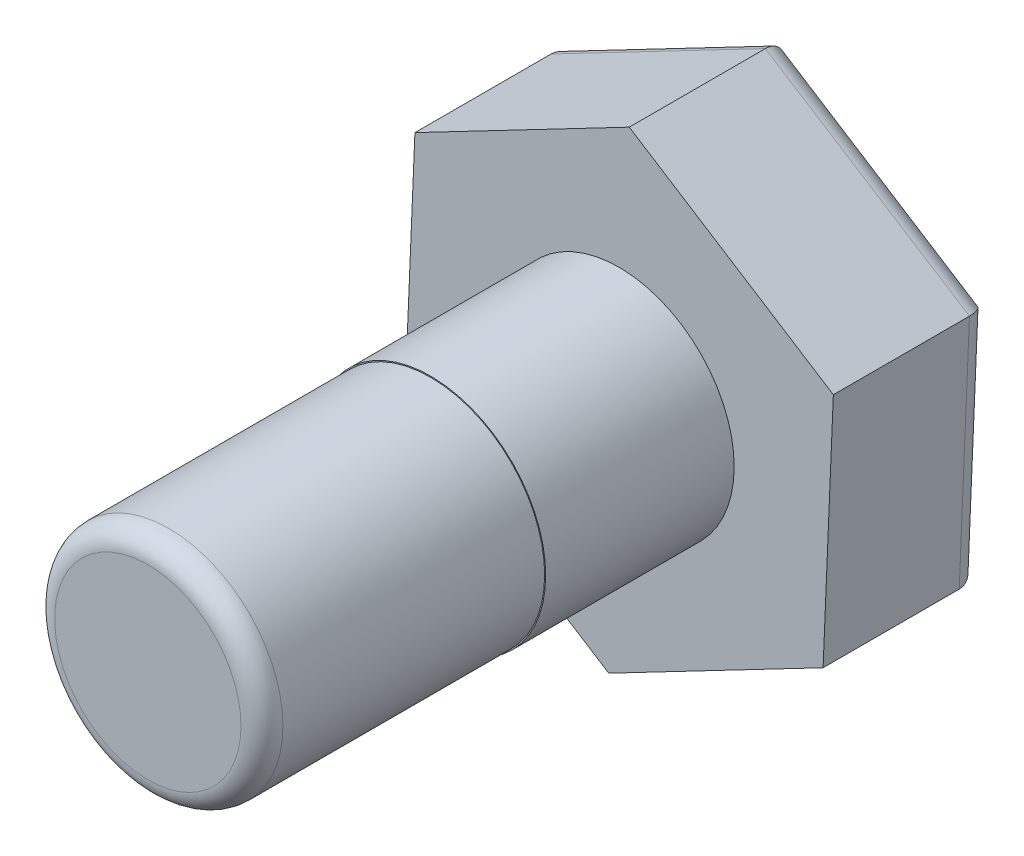
ISO-10303-21;
HEADER;
FILE_DESCRIPTION(('STEP AP214'),'2;1');
FILE_NAME('part.step','',(''),(''),'','','');
FILE_SCHEMA(('AUTOMOTIVE_DESIGN { 1 0 10303 214 1 1 1 1 }'));
ENDSEC;
DATA;
#1=APPLICATION_CONTEXT('core data for automotive mechanical design processes');
#2=APPLICATION_PROTOCOL_DEFINITION('international standard','automotive_design',2000,#1);
#3=PRODUCT_CONTEXT('',#1,'mechanical');
#4=PRODUCT('Part','Part','',(#3));
#5=PRODUCT_RELATED_PRODUCT_CATEGORY('part','',(#4));
#6=PRODUCT_DEFINITION_FORMATION('','',#4);
#7=PRODUCT_DEFINITION_CONTEXT('part definition',#1,'design');
#8=PRODUCT_DEFINITION('design','',#6,#7);
#9=PRODUCT_DEFINITION_SHAPE('','',#8);
#10=(LENGTH_UNIT() NAMED_UNIT(*) SI_UNIT(.MILLI.,.METRE.));
#11=(NAMED_UNIT(*) PLANE_ANGLE_UNIT() SI_UNIT($,.RADIAN.));
#12=(NAMED_UNIT(*) SI_UNIT($,.STERADIAN.) SOLID_ANGLE_UNIT());
#13=UNCERTAINTY_MEASURE_WITH_UNIT(LENGTH_MEASURE(1.E-05),#10,'distance_accuracy_value','');
#14=(GEOMETRIC_REPRESENTATION_CONTEXT(3) GLOBAL_UNCERTAINTY_ASSIGNED_CONTEXT((#13)) GLOBAL_UNIT_ASSIGNED_CONTEXT((#10,
#11,#12)) REPRESENTATION_CONTEXT('',''));
#15=CARTESIAN_POINT('',(0.,0.,0.));
#16=DIRECTION('',(0.,0.,1.));
#17=DIRECTION('',(1.,0.,0.));
#18=AXIS2_PLACEMENT_3D('',#15,#16,#17);
#19=CARTESIAN_POINT('',(0.,0.,33.));
#20=DIRECTION('',(0.,0.,1.));
#21=DIRECTION('',(1.,0.,0.));
#22=AXIS2_PLACEMENT_3D('',#19,#20,#21);
#23=PLANE('',#22);
#24=CARTESIAN_POINT('',(0.,0.,33.));
#25=DIRECTION('',(0.,0.,1.));
#26=DIRECTION('',(1.,0.,0.));
#27=AXIS2_PLACEMENT_3D('',#24,#25,#26);
#28=CIRCLE('',#27,11.);
#29=CARTESIAN_POINT('',(11.,0.,33.));
#30=VERTEX_POINT('',#29);
#31=EDGE_CURVE('E130',#30,#30,#28,.T.);
#32=ORIENTED_EDGE('',*,*,#31,.T.);
#33=EDGE_LOOP('',(#32));
#34=FACE_BOUND('',#33,.T.);
#35=CARTESIAN_POINT('',(0.,0.,33.));
#36=DIRECTION('',(0.,0.,1.));
#37=DIRECTION('',(1.,0.,0.));
#38=AXIS2_PLACEMENT_3D('',#35,#36,#37);
#39=CIRCLE('',#38,10.9);
#40=CARTESIAN_POINT('',(10.9,0.,33.));
#41=VERTEX_POINT('',#40);
#42=EDGE_CURVE('E165',#41,#41,#39,.T.);
#43=ORIENTED_EDGE('',*,*,#42,.F.);
#44=EDGE_LOOP('',(#43));
#45=FACE_BOUND('',#44,.T.);
#46=ADVANCED_FACE('F36',(#34,#45),#23,.T.);
#47=CARTESIAN_POINT('',(21.4532721099387,33.7602890357432,15.));
#48=DIRECTION('',(0.,0.,1.));
#49=DIRECTION('',(1.,0.,0.));
#50=AXIS2_PLACEMENT_3D('',#47,#48,#49);
#51=PLANE('',#50);
#52=DIRECTION('',(0.0424733530908878,0.999097599975707,0.));
#53=VECTOR('',#52,1.);
#54=CARTESIAN_POINT('',(19.4915119627059,-12.3860524276714,15.));
#55=LINE('',#54,#53);
#56=CARTESIAN_POINT('',(19.4915119627059,-12.3860524276714,15.));
#57=VERTEX_POINT('',#56);
#58=CARTESIAN_POINT('',(20.4723920363223,10.6871183040359,15.));
#59=VERTEX_POINT('',#58);
#60=EDGE_CURVE('E122',#57,#59,#55,.T.);
#61=ORIENTED_EDGE('',*,*,#60,.T.);
#62=DIRECTION('',(-0.844007225893581,0.536331802748468,0.));
#63=VECTOR('',#62,1.);
#64=CARTESIAN_POINT('',(20.4723920363223,10.6871183040359,15.));
#65=LINE('',#64,#63);
#66=CARTESIAN_POINT('',(0.980880073616411,23.0731707317073,15.));
#67=VERTEX_POINT('',#66);
#68=EDGE_CURVE('E110',#59,#67,#65,.T.);
#69=ORIENTED_EDGE('',*,*,#68,.T.);
#70=DIRECTION('',(-0.886480578984469,-0.462765797227238,0.));
#71=VECTOR('',#70,1.);
#72=CARTESIAN_POINT('',(0.980880073616411,23.0731707317073,15.));
#73=LINE('',#72,#71);
#74=CARTESIAN_POINT('',(-19.4915119627059,12.3860524276714,15.));
#75=VERTEX_POINT('',#74);
#76=EDGE_CURVE('E121',#67,#75,#73,.T.);
#77=ORIENTED_EDGE('',*,*,#76,.T.);
#78=DIRECTION('',(-0.0424733530908877,-0.999097599975707,0.));
#79=VECTOR('',#78,1.);
#80=CARTESIAN_POINT('',(-19.4915119627059,12.3860524276714,15.));
#81=LINE('',#80,#79);
#82=CARTESIAN_POINT('',(-20.4723920363223,-10.6871183040359,15.));
#83=VERTEX_POINT('',#82);
#84=EDGE_CURVE('E270',#75,#83,#81,.T.);
#85=ORIENTED_EDGE('',*,*,#84,.T.);
#86=DIRECTION('',(0.844007225893581,-0.536331802748469,0.));
#87=VECTOR('',#86,1.);
#88=CARTESIAN_POINT('',(-20.4723920363223,-10.6871183040359,15.));
#89=LINE('',#88,#87);
#90=CARTESIAN_POINT('',(-0.980880073616402,-23.0731707317073,15.));
#91=VERTEX_POINT('',#90);
#92=EDGE_CURVE('E272',#83,#91,#89,.T.);
#93=ORIENTED_EDGE('',*,*,#92,.T.);
#94=DIRECTION('',(0.886480578984469,0.462765797227238,0.));
#95=VECTOR('',#94,1.);
#96=CARTESIAN_POINT('',(-0.980880073616402,-23.0731707317073,15.));
#97=LINE('',#96,#95);
#98=EDGE_CURVE('E128',#91,#57,#97,.T.);
#99=ORIENTED_EDGE('',*,*,#98,.T.);
#100=EDGE_LOOP('',(#61,#69,#77,#85,#93,#99));
#101=FACE_BOUND('',#100,.T.);
#102=CARTESIAN_POINT('',(0.,0.,15.));
#103=DIRECTION('',(0.,0.,1.));
#104=DIRECTION('',(1.,0.,0.));
#105=AXIS2_PLACEMENT_3D('',#102,#103,#104);
#106=CIRCLE('',#105,11.);
#107=CARTESIAN_POINT('',(11.,0.,15.));
#108=VERTEX_POINT('',#107);
#109=EDGE_CURVE('E178',#108,#108,#106,.T.);
#110=ORIENTED_EDGE('',*,*,#109,.F.);
#111=EDGE_LOOP('',(#110));
#112=FACE_BOUND('',#111,.T.);
#113=ADVANCED_FACE('F125',(#101,#112),#51,.T.);
#114=CARTESIAN_POINT('',(19.4915119627059,-12.3860524276714,15.));
#115=DIRECTION('',(-0.999097599975706,0.0424733530908878,0.));
#116=DIRECTION('',(-0.0424733530908878,-0.999097599975706,0.));
#117=AXIS2_PLACEMENT_3D('',#114,#115,#116);
#118=PLANE('',#117);
#119=DIRECTION('',(0.,0.,-1.));
#120=VECTOR('',#119,1.);
#121=CARTESIAN_POINT('',(19.4915119627059,-12.3860524276714,15.));
#122=LINE('',#121,#120);
#123=CARTESIAN_POINT('',(19.4915119627059,-12.3860524276714,2.));
#124=VERTEX_POINT('',#123);
#125=EDGE_CURVE('E277',#57,#124,#122,.T.);
#126=ORIENTED_EDGE('',*,*,#125,.T.);
#127=DIRECTION('',(0.0424733530908878,0.999097599975706,0.));
#128=VECTOR('',#127,1.);
#129=CARTESIAN_POINT('',(19.4915119627059,-12.3860524276714,2.));
#130=LINE('',#129,#128);
#131=CARTESIAN_POINT('',(20.4723920363223,10.6871183040359,2.));
#132=VERTEX_POINT('',#131);
#133=EDGE_CURVE('E134',#124,#132,#130,.T.);
#134=ORIENTED_EDGE('',*,*,#133,.T.);
#135=DIRECTION('',(0.,0.,-1.));
#136=VECTOR('',#135,1.);
#137=CARTESIAN_POINT('',(20.4723920363223,10.6871183040359,15.));
#138=LINE('',#137,#136);
#139=EDGE_CURVE('E115',#59,#132,#138,.T.);
#140=ORIENTED_EDGE('',*,*,#139,.F.);
#141=ORIENTED_EDGE('',*,*,#60,.F.);
#142=EDGE_LOOP('',(#126,#134,#140,#141));
#143=FACE_BOUND('',#142,.T.);
#144=ADVANCED_FACE('F132',(#143),#118,.F.);
#145=CARTESIAN_POINT('',(20.4723920363223,10.6871183040359,15.));
#146=DIRECTION('',(-0.536331802748468,-0.844007225893581,0.));
#147=DIRECTION('',(0.844007225893581,-0.536331802748468,0.));
#148=AXIS2_PLACEMENT_3D('',#145,#146,#147);
#149=PLANE('',#148);
#150=ORIENTED_EDGE('',*,*,#139,.T.);
#151=DIRECTION('',(-0.844007225893581,0.536331802748468,0.));
#152=VECTOR('',#151,1.);
#153=CARTESIAN_POINT('',(20.4723920363223,10.6871183040359,2.));
#154=LINE('',#153,#152);
#155=CARTESIAN_POINT('',(0.980880073616411,23.0731707317073,2.));
#156=VERTEX_POINT('',#155);
#157=EDGE_CURVE('E135',#132,#156,#154,.T.);
#158=ORIENTED_EDGE('',*,*,#157,.T.);
#159=DIRECTION('',(0.,0.,-1.));
#160=VECTOR('',#159,1.);
#161=CARTESIAN_POINT('',(0.980880073616411,23.0731707317073,15.));
#162=LINE('',#161,#160);
#163=EDGE_CURVE('E118',#67,#156,#162,.T.);
#164=ORIENTED_EDGE('',*,*,#163,.F.);
#165=ORIENTED_EDGE('',*,*,#68,.F.);
#166=EDGE_LOOP('',(#150,#158,#164,#165));
#167=FACE_BOUND('',#166,.T.);
#168=ADVANCED_FACE('F112',(#167),#149,.F.);
#169=CARTESIAN_POINT('',(0.980880073616411,23.0731707317073,15.));
#170=DIRECTION('',(0.462765797227238,-0.886480578984469,0.));
#171=DIRECTION('',(0.886480578984469,0.462765797227238,0.));
#172=AXIS2_PLACEMENT_3D('',#169,#170,#171);
#173=PLANE('',#172);
#174=ORIENTED_EDGE('',*,*,#163,.T.);
#175=DIRECTION('',(-0.886480578984469,-0.462765797227238,0.));
#176=VECTOR('',#175,1.);
#177=CARTESIAN_POINT('',(0.980880073616411,23.0731707317073,2.));
#178=LINE('',#177,#176);
#179=CARTESIAN_POINT('',(-19.4915119627059,12.3860524276714,2.));
#180=VERTEX_POINT('',#179);
#181=EDGE_CURVE('E155',#156,#180,#178,.T.);
#182=ORIENTED_EDGE('',*,*,#181,.T.);
#183=DIRECTION('',(0.,0.,-1.));
#184=VECTOR('',#183,1.);
#185=CARTESIAN_POINT('',(-19.4915119627059,12.3860524276714,15.));
#186=LINE('',#185,#184);
#187=EDGE_CURVE('E139',#75,#180,#186,.T.);
#188=ORIENTED_EDGE('',*,*,#187,.F.);
#189=ORIENTED_EDGE('',*,*,#76,.F.);
#190=EDGE_LOOP('',(#174,#182,#188,#189));
#191=FACE_BOUND('',#190,.T.);
#192=ADVANCED_FACE('F221',(#191),#173,.F.);
#193=CARTESIAN_POINT('',(-19.4915119627059,12.3860524276714,15.));
#194=DIRECTION('',(0.999097599975706,-0.0424733530908877,0.));
#195=DIRECTION('',(0.0424733530908877,0.999097599975706,0.));
#196=AXIS2_PLACEMENT_3D('',#193,#194,#195);
#197=PLANE('',#196);
#198=ORIENTED_EDGE('',*,*,#187,.T.);
#199=DIRECTION('',(-0.0424733530908877,-0.999097599975706,0.));
#200=VECTOR('',#199,1.);
#201=CARTESIAN_POINT('',(-19.4915119627059,12.3860524276714,2.));
#202=LINE('',#201,#200);
#203=CARTESIAN_POINT('',(-20.4723920363223,-10.6871183040359,2.));
#204=VERTEX_POINT('',#203);
#205=EDGE_CURVE('E157',#180,#204,#202,.T.);
#206=ORIENTED_EDGE('',*,*,#205,.T.);
#207=DIRECTION('',(0.,0.,-1.));
#208=VECTOR('',#207,1.);
#209=CARTESIAN_POINT('',(-20.4723920363223,-10.6871183040359,15.));
#210=LINE('',#209,#208);
#211=EDGE_CURVE('E281',#83,#204,#210,.T.);
#212=ORIENTED_EDGE('',*,*,#211,.F.);
#213=ORIENTED_EDGE('',*,*,#84,.F.);
#214=EDGE_LOOP('',(#198,#206,#212,#213));
#215=FACE_BOUND('',#214,.T.);
#216=ADVANCED_FACE('F218',(#215),#197,.F.);
#217=CARTESIAN_POINT('',(-20.4723920363223,-10.6871183040359,15.));
#218=DIRECTION('',(0.536331802748468,0.844007225893581,0.));
#219=DIRECTION('',(-0.844007225893581,0.536331802748468,0.));
#220=AXIS2_PLACEMENT_3D('',#217,#218,#219);
#221=PLANE('',#220);
#222=ORIENTED_EDGE('',*,*,#211,.T.);
#223=DIRECTION('',(0.844007225893581,-0.536331802748468,0.));
#224=VECTOR('',#223,1.);
#225=CARTESIAN_POINT('',(-20.4723920363223,-10.6871183040359,2.));
#226=LINE('',#225,#224);
#227=CARTESIAN_POINT('',(-0.980880073616402,-23.0731707317073,2.));
#228=VERTEX_POINT('',#227);
#229=EDGE_CURVE('E59',#204,#228,#226,.T.);
#230=ORIENTED_EDGE('',*,*,#229,.T.);
#231=DIRECTION('',(0.,0.,-1.));
#232=VECTOR('',#231,1.);
#233=CARTESIAN_POINT('',(-0.980880073616402,-23.0731707317073,15.));
#234=LINE('',#233,#232);
#235=EDGE_CURVE('E279',#91,#228,#234,.T.);
#236=ORIENTED_EDGE('',*,*,#235,.F.);
#237=ORIENTED_EDGE('',*,*,#92,.F.);
#238=EDGE_LOOP('',(#222,#230,#236,#237));
#239=FACE_BOUND('',#238,.T.);
#240=ADVANCED_FACE('F215',(#239),#221,.F.);
#241=CARTESIAN_POINT('',(-0.980880073616402,-23.0731707317073,15.));
#242=DIRECTION('',(-0.462765797227238,0.886480578984469,0.));
#243=DIRECTION('',(-0.886480578984469,-0.462765797227238,0.));
#244=AXIS2_PLACEMENT_3D('',#241,#242,#243);
#245=PLANE('',#244);
#246=ORIENTED_EDGE('',*,*,#235,.T.);
#247=DIRECTION('',(0.886480578984469,0.462765797227238,0.));
#248=VECTOR('',#247,1.);
#249=CARTESIAN_POINT('',(-0.980880073616402,-23.0731707317073,2.));
#250=LINE('',#249,#248);
#251=EDGE_CURVE('E51',#228,#124,#250,.T.);
#252=ORIENTED_EDGE('',*,*,#251,.T.);
#253=ORIENTED_EDGE('',*,*,#125,.F.);
#254=ORIENTED_EDGE('',*,*,#98,.F.);
#255=EDGE_LOOP('',(#246,#252,#253,#254));
#256=FACE_BOUND('',#255,.T.);
#257=ADVANCED_FACE('F211',(#256),#245,.F.);
#258=CARTESIAN_POINT('',(21.4532721099387,33.7602890357432,0.));
#259=DIRECTION('',(0.,0.,1.));
#260=DIRECTION('',(1.,0.,0.));
#261=AXIS2_PLACEMENT_3D('',#258,#259,#260);
#262=PLANE('',#261);
#263=DIRECTION('',(-0.886480578984469,-0.462765797227238,0.));
#264=VECTOR('',#263,1.);
#265=CARTESIAN_POINT('',(22.3788037043932,31.9873278777743,0.));
#266=LINE('',#265,#264);
#267=CARTESIAN_POINT('',(-17.5423607664353,11.1474471849043,0.));
#268=VERTEX_POINT('',#267);
#269=CARTESIAN_POINT('',(0.882792066254768,20.7658536585366,0.));
#270=VERTEX_POINT('',#269);
#271=EDGE_CURVE('E150',#268,#270,#266,.F.);
#272=ORIENTED_EDGE('',*,*,#271,.T.);
#273=DIRECTION('',(-0.844007225893581,0.536331802748468,0.));
#274=VECTOR('',#273,1.);
#275=CARTESIAN_POINT('',(9.65397244947244,15.1921300660844,0.));
#276=LINE('',#275,#274);
#277=CARTESIAN_POINT('',(18.4251528326901,9.61840647363232,0.));
#278=VERTEX_POINT('',#277);
#279=EDGE_CURVE('E152',#270,#278,#276,.F.);
#280=ORIENTED_EDGE('',*,*,#279,.T.);
#281=DIRECTION('',(0.0424733530908878,0.999097599975706,0.));
#282=VECTOR('',#281,1.);
#283=CARTESIAN_POINT('',(19.4550769099873,33.845235741925,0.));
#284=LINE('',#283,#282);
#285=CARTESIAN_POINT('',(17.5423607664353,-11.1474471849043,0.));
#286=VERTEX_POINT('',#285);
#287=EDGE_CURVE('E137',#278,#286,#284,.F.);
#288=ORIENTED_EDGE('',*,*,#287,.T.);
#289=DIRECTION('',(0.886480578984469,0.462765797227238,0.));
#290=VECTOR('',#289,1.);
#291=CARTESIAN_POINT('',(39.0383724045738,0.0740270343334015,0.));
#292=LINE('',#291,#290);
#293=CARTESIAN_POINT('',(-0.882792066254761,-20.7658536585366,0.));
#294=VERTEX_POINT('',#293);
#295=EDGE_CURVE('E144',#286,#294,#292,.F.);
#296=ORIENTED_EDGE('',*,*,#295,.T.);
#297=DIRECTION('',(0.844007225893581,-0.536331802748468,0.));
#298=VECTOR('',#297,1.);
#299=CARTESIAN_POINT('',(-9.65397244947243,-15.1921300660844,0.));
#300=LINE('',#299,#298);
#301=CARTESIAN_POINT('',(-18.4251528326901,-9.61840647363232,0.));
#302=VERTEX_POINT('',#301);
#303=EDGE_CURVE('E146',#294,#302,#300,.F.);
#304=ORIENTED_EDGE('',*,*,#303,.T.);
#305=DIRECTION('',(-0.0424733530908877,-0.999097599975706,0.));
#306=VECTOR('',#305,1.);
#307=CARTESIAN_POINT('',(-16.5124366891381,35.374276453197,0.));
#308=LINE('',#307,#306);
#309=EDGE_CURVE('E148',#302,#268,#308,.F.);
#310=ORIENTED_EDGE('',*,*,#309,.T.);
#311=EDGE_LOOP('',(#272,#280,#288,#296,#304,#310));
#312=FACE_BOUND('',#311,.T.);
#313=ADVANCED_FACE('F206',(#312),#262,.F.);
#314=CARTESIAN_POINT('',(0.,0.,33.));
#315=DIRECTION('',(0.,0.,-1.));
#316=DIRECTION('',(-1.,0.,0.));
#317=AXIS2_PLACEMENT_3D('',#314,#315,#316);
#318=CYLINDRICAL_SURFACE('',#317,11.);
#319=ORIENTED_EDGE('',*,*,#31,.F.);
#320=EDGE_LOOP('',(#319));
#321=FACE_BOUND('',#320,.T.);
#322=ORIENTED_EDGE('',*,*,#109,.T.);
#323=EDGE_LOOP('',(#322));
#324=FACE_BOUND('',#323,.T.);
#325=ADVANCED_FACE('F203',(#321,#324),#318,.T.);
#326=CARTESIAN_POINT('',(-19.3997284308254,-8.99910385224874,2.));
#327=DIRECTION('',(0.844007225893581,-0.536331802748468,0.));
#328=DIRECTION('',(0.536331802748468,0.844007225893581,0.));
#329=AXIS2_PLACEMENT_3D('',#326,#327,#328);
#330=CYLINDRICAL_SURFACE('',#329,2.);
#331=CARTESIAN_POINT('',(-18.4251528326901,-9.61840647363232,2.));
#332=DIRECTION('',(0.462765797227238,-0.886480578984469,0.));
#333=DIRECTION('',(0.886480578984469,0.462765797227238,0.));
#334=AXIS2_PLACEMENT_3D('',#331,#332,#333);
#335=ELLIPSE('',#334,2.3094010767585,2.);
#336=EDGE_CURVE('E173',#302,#204,#335,.F.);
#337=ORIENTED_EDGE('',*,*,#336,.F.);
#338=ORIENTED_EDGE('',*,*,#303,.F.);
#339=CARTESIAN_POINT('',(-0.882792066254761,-20.7658536585366,2.));
#340=DIRECTION('',(0.999097599975706,-0.042473353090888,0.));
#341=DIRECTION('',(0.042473353090888,0.999097599975707,0.));
#342=AXIS2_PLACEMENT_3D('',#339,#340,#341);
#343=ELLIPSE('',#342,2.3094010767585,2.);
#344=EDGE_CURVE('E176',#228,#294,#343,.T.);
#345=ORIENTED_EDGE('',*,*,#344,.F.);
#346=ORIENTED_EDGE('',*,*,#229,.F.);
#347=EDGE_LOOP('',(#337,#338,#345,#346));
#348=FACE_BOUND('',#347,.T.);
#349=ADVANCED_FACE('F205',(#348),#330,.T.);
#350=CARTESIAN_POINT('',(-1.90641166807088,-21.3002095737384,2.));
#351=DIRECTION('',(0.886480578984469,0.462765797227238,0.));
#352=DIRECTION('',(-0.462765797227238,0.886480578984469,0.));
#353=AXIS2_PLACEMENT_3D('',#350,#351,#352);
#354=CYLINDRICAL_SURFACE('',#353,2.);
#355=ORIENTED_EDGE('',*,*,#344,.T.);
#356=ORIENTED_EDGE('',*,*,#295,.F.);
#357=CARTESIAN_POINT('',(17.5423607664353,-11.1474471849043,2.));
#358=DIRECTION('',(0.536331802748468,0.844007225893581,0.));
#359=DIRECTION('',(-0.844007225893581,0.536331802748469,0.));
#360=AXIS2_PLACEMENT_3D('',#357,#358,#359);
#361=ELLIPSE('',#360,2.3094010767585,2.);
#362=EDGE_CURVE('E170',#124,#286,#361,.T.);
#363=ORIENTED_EDGE('',*,*,#362,.F.);
#364=ORIENTED_EDGE('',*,*,#251,.F.);
#365=EDGE_LOOP('',(#355,#356,#363,#364));
#366=FACE_BOUND('',#365,.T.);
#367=ADVANCED_FACE('F245',(#366),#354,.T.);
#368=CARTESIAN_POINT('',(-17.4933167627545,12.3011057214896,2.));
#369=DIRECTION('',(-0.0424733530908877,-0.999097599975706,0.));
#370=DIRECTION('',(0.999097599975706,-0.0424733530908877,0.));
#371=AXIS2_PLACEMENT_3D('',#368,#369,#370);
#372=CYLINDRICAL_SURFACE('',#371,2.);
#373=ORIENTED_EDGE('',*,*,#336,.T.);
#374=ORIENTED_EDGE('',*,*,#205,.F.);
#375=CARTESIAN_POINT('',(-17.5423607664353,11.1474471849043,2.));
#376=DIRECTION('',(-0.536331802748468,-0.844007225893581,0.));
#377=DIRECTION('',(0.844007225893581,-0.536331802748468,0.));
#378=AXIS2_PLACEMENT_3D('',#375,#376,#377);
#379=ELLIPSE('',#378,2.3094010767585,2.);
#380=EDGE_CURVE('E167',#268,#180,#379,.F.);
#381=ORIENTED_EDGE('',*,*,#380,.F.);
#382=ORIENTED_EDGE('',*,*,#309,.F.);
#383=EDGE_LOOP('',(#373,#374,#381,#382));
#384=FACE_BOUND('',#383,.T.);
#385=ADVANCED_FACE('F241',(#384),#372,.T.);
#386=CARTESIAN_POINT('',(17.4933167627545,-12.3011057214897,2.));
#387=DIRECTION('',(0.0424733530908878,0.999097599975706,0.));
#388=DIRECTION('',(-0.999097599975706,0.0424733530908878,0.));
#389=AXIS2_PLACEMENT_3D('',#386,#387,#388);
#390=CYLINDRICAL_SURFACE('',#389,2.);
#391=ORIENTED_EDGE('',*,*,#362,.T.);
#392=ORIENTED_EDGE('',*,*,#287,.F.);
#393=CARTESIAN_POINT('',(18.4251528326901,9.61840647363231,2.));
#394=DIRECTION('',(-0.462765797227238,0.886480578984469,0.));
#395=DIRECTION('',(0.886480578984469,0.462765797227238,0.));
#396=AXIS2_PLACEMENT_3D('',#393,#394,#395);
#397=ELLIPSE('',#396,2.3094010767585,2.);
#398=EDGE_CURVE('E164',#132,#278,#397,.T.);
#399=ORIENTED_EDGE('',*,*,#398,.F.);
#400=ORIENTED_EDGE('',*,*,#133,.F.);
#401=EDGE_LOOP('',(#391,#392,#399,#400));
#402=FACE_BOUND('',#401,.T.);
#403=ADVANCED_FACE('F237',(#402),#390,.T.);
#404=CARTESIAN_POINT('',(1.90641166807089,21.3002095737384,2.));
#405=DIRECTION('',(-0.886480578984469,-0.462765797227238,0.));
#406=DIRECTION('',(0.462765797227238,-0.886480578984469,0.));
#407=AXIS2_PLACEMENT_3D('',#404,#405,#406);
#408=CYLINDRICAL_SURFACE('',#407,2.);
#409=ORIENTED_EDGE('',*,*,#380,.T.);
#410=ORIENTED_EDGE('',*,*,#181,.F.);
#411=CARTESIAN_POINT('',(0.882792066254761,20.7658536585366,2.));
#412=DIRECTION('',(-0.999097599975706,0.042473353090888,0.));
#413=DIRECTION('',(-0.0424733530908879,-0.999097599975706,0.));
#414=AXIS2_PLACEMENT_3D('',#411,#412,#413);
#415=ELLIPSE('',#414,2.3094010767585,2.);
#416=EDGE_CURVE('E162',#270,#156,#415,.F.);
#417=ORIENTED_EDGE('',*,*,#416,.F.);
#418=ORIENTED_EDGE('',*,*,#271,.F.);
#419=EDGE_LOOP('',(#409,#410,#417,#418));
#420=FACE_BOUND('',#419,.T.);
#421=ADVANCED_FACE('F233',(#420),#408,.T.);
#422=CARTESIAN_POINT('',(19.3997284308254,8.99910385224875,2.));
#423=DIRECTION('',(-0.844007225893581,0.536331802748468,0.));
#424=DIRECTION('',(-0.536331802748468,-0.844007225893581,0.));
#425=AXIS2_PLACEMENT_3D('',#422,#423,#424);
#426=CYLINDRICAL_SURFACE('',#425,2.);
#427=ORIENTED_EDGE('',*,*,#398,.T.);
#428=ORIENTED_EDGE('',*,*,#279,.F.);
#429=ORIENTED_EDGE('',*,*,#416,.T.);
#430=ORIENTED_EDGE('',*,*,#157,.F.);
#431=EDGE_LOOP('',(#427,#428,#429,#430));
#432=FACE_BOUND('',#431,.T.);
#433=ADVANCED_FACE('F230',(#432),#426,.T.);
#434=CARTESIAN_POINT('',(0.,0.,60.));
#435=DIRECTION('',(0.,0.,-1.));
#436=DIRECTION('',(-1.,0.,0.));
#437=AXIS2_PLACEMENT_3D('',#434,#435,#436);
#438=CYLINDRICAL_SURFACE('',#437,10.9);
#439=CARTESIAN_POINT('',(0.,0.,58.));
#440=DIRECTION('',(0.,0.,1.));
#441=DIRECTION('',(1.,0.,0.));
#442=AXIS2_PLACEMENT_3D('',#439,#440,#441);
#443=CIRCLE('',#442,10.9);
#444=CARTESIAN_POINT('',(10.9,0.,58.));
#445=VERTEX_POINT('',#444);
#446=EDGE_CURVE('E11',#445,#445,#443,.F.);
#447=ORIENTED_EDGE('',*,*,#446,.T.);
#448=EDGE_LOOP('',(#447));
#449=FACE_BOUND('',#448,.T.);
#450=ORIENTED_EDGE('',*,*,#42,.T.);
#451=EDGE_LOOP('',(#450));
#452=FACE_BOUND('',#451,.T.);
#453=ADVANCED_FACE('F189',(#449,#452),#438,.T.);
#454=CARTESIAN_POINT('',(0.,0.,60.));
#455=DIRECTION('',(0.,0.,1.));
#456=DIRECTION('',(1.,0.,0.));
#457=AXIS2_PLACEMENT_3D('',#454,#455,#456);
#458=PLANE('',#457);
#459=CARTESIAN_POINT('',(0.,0.,60.));
#460=DIRECTION('',(0.,0.,1.));
#461=DIRECTION('',(1.,0.,0.));
#462=AXIS2_PLACEMENT_3D('',#459,#460,#461);
#463=CIRCLE('',#462,8.9);
#464=CARTESIAN_POINT('',(8.9,0.,60.));
#465=VERTEX_POINT('',#464);
#466=EDGE_CURVE('E44',#465,#465,#463,.T.);
#467=ORIENTED_EDGE('',*,*,#466,.T.);
#468=EDGE_LOOP('',(#467));
#469=FACE_BOUND('',#468,.T.);
#470=ADVANCED_FACE('F182',(#469),#458,.T.);
#471=CARTESIAN_POINT('',(0.,0.,58.));
#472=DIRECTION('',(0.,0.,1.));
#473=DIRECTION('',(1.,0.,0.));
#474=AXIS2_PLACEMENT_3D('',#471,#472,#473);
#475=TOROIDAL_SURFACE('',#474,8.9,2.);
#476=ORIENTED_EDGE('',*,*,#446,.F.);
#477=EDGE_LOOP('',(#476));
#478=FACE_BOUND('',#477,.T.);
#479=ORIENTED_EDGE('',*,*,#466,.F.);
#480=EDGE_LOOP('',(#479));
#481=FACE_BOUND('',#480,.T.);
#482=ADVANCED_FACE('F38',(#478,#481),#475,.T.);
#483=CLOSED_SHELL('',(#46,#113,#144,#168,#192,#216,#240,#257,#313,#325,#349,#367,#385,#403,#421,
#433,#453,#470,#482));
#484=MANIFOLD_SOLID_BREP('B2',#483);
#485=ADVANCED_BREP_SHAPE_REPRESENTATION('',(#18,#484),#14);
#486=SHAPE_DEFINITION_REPRESENTATION(#9,#485);
ENDSEC;
END-ISO-10303-21;
